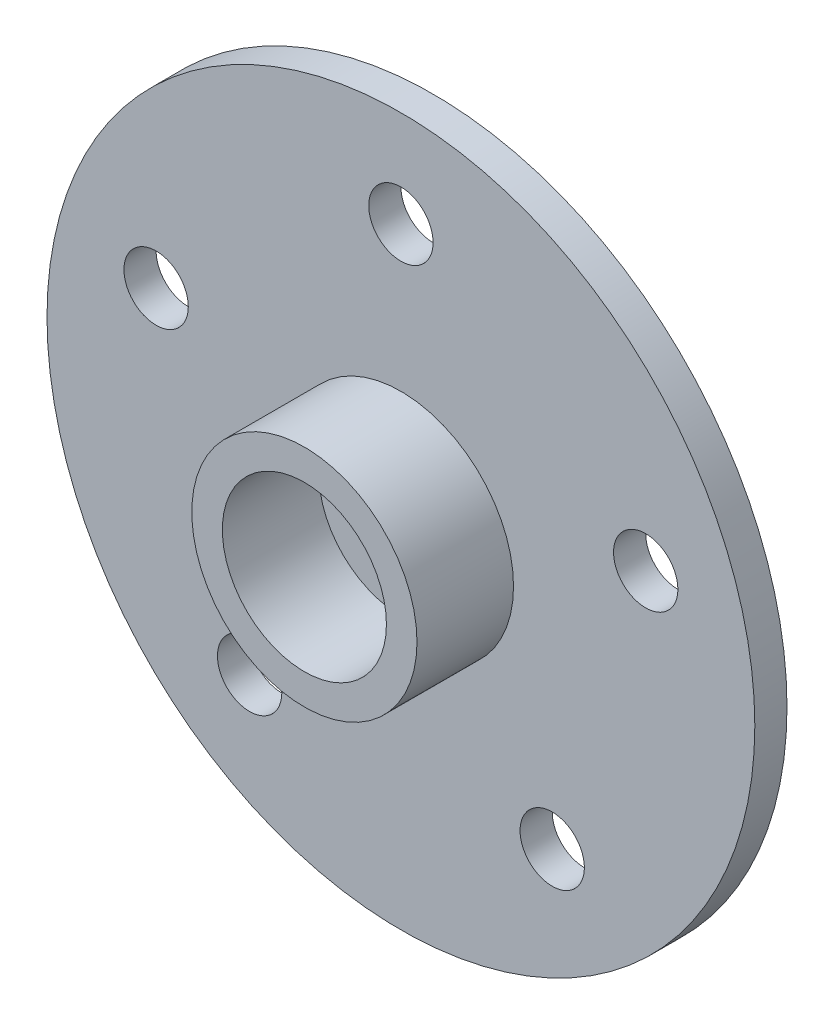
ISO-10303-21;
HEADER;
FILE_DESCRIPTION(('STEP AP214'),'2;1');
FILE_NAME('part.step','',(''),(''),'','','');
FILE_SCHEMA(('AUTOMOTIVE_DESIGN { 1 0 10303 214 1 1 1 1 }'));
ENDSEC;
DATA;
#1=APPLICATION_CONTEXT('core data for automotive mechanical design processes');
#2=APPLICATION_PROTOCOL_DEFINITION('international standard','automotive_design',2000,#1);
#3=PRODUCT_CONTEXT('',#1,'mechanical');
#4=PRODUCT('Part','Part','',(#3));
#5=PRODUCT_RELATED_PRODUCT_CATEGORY('part','',(#4));
#6=PRODUCT_DEFINITION_FORMATION('','',#4);
#7=PRODUCT_DEFINITION_CONTEXT('part definition',#1,'design');
#8=PRODUCT_DEFINITION('design','',#6,#7);
#9=PRODUCT_DEFINITION_SHAPE('','',#8);
#10=(LENGTH_UNIT() NAMED_UNIT(*) SI_UNIT(.MILLI.,.METRE.));
#11=(NAMED_UNIT(*) PLANE_ANGLE_UNIT() SI_UNIT($,.RADIAN.));
#12=(NAMED_UNIT(*) SI_UNIT($,.STERADIAN.) SOLID_ANGLE_UNIT());
#13=UNCERTAINTY_MEASURE_WITH_UNIT(LENGTH_MEASURE(1.E-05),#10,'distance_accuracy_value','');
#14=(GEOMETRIC_REPRESENTATION_CONTEXT(3) GLOBAL_UNCERTAINTY_ASSIGNED_CONTEXT((#13)) GLOBAL_UNIT_ASSIGNED_CONTEXT((#10,
#11,#12)) REPRESENTATION_CONTEXT('',''));
#15=CARTESIAN_POINT('',(0.,0.,0.));
#16=DIRECTION('',(0.,0.,1.));
#17=DIRECTION('',(1.,0.,0.));
#18=AXIS2_PLACEMENT_3D('',#15,#16,#17);
#19=CARTESIAN_POINT('',(0.,0.,2.));
#20=DIRECTION('',(0.,0.,1.));
#21=DIRECTION('',(1.,0.,0.));
#22=AXIS2_PLACEMENT_3D('',#19,#20,#21);
#23=PLANE('',#22);
#24=CARTESIAN_POINT('',(0.,0.,2.));
#25=DIRECTION('',(0.,0.,1.));
#26=DIRECTION('',(1.,0.,0.));
#27=AXIS2_PLACEMENT_3D('',#24,#25,#26);
#28=CIRCLE('',#27,3.15);
#29=CARTESIAN_POINT('',(3.15,0.,2.));
#30=VERTEX_POINT('',#29);
#31=EDGE_CURVE('E60',#30,#30,#28,.T.);
#32=ORIENTED_EDGE('',*,*,#31,.F.);
#33=EDGE_LOOP('',(#32));
#34=FACE_BOUND('',#33,.T.);
#35=CARTESIAN_POINT('',(0.,0.,2.));
#36=DIRECTION('',(0.,0.,1.));
#37=DIRECTION('',(1.,0.,0.));
#38=AXIS2_PLACEMENT_3D('',#35,#36,#37);
#39=CIRCLE('',#38,5.1);
#40=CARTESIAN_POINT('',(5.1,0.,2.));
#41=VERTEX_POINT('',#40);
#42=EDGE_CURVE('E10',#41,#41,#39,.F.);
#43=ORIENTED_EDGE('',*,*,#42,.F.);
#44=EDGE_LOOP('',(#43));
#45=FACE_BOUND('',#44,.T.);
#46=ADVANCED_FACE('F33',(#34,#45),#23,.T.);
#47=CARTESIAN_POINT('',(0.,0.,2.));
#48=DIRECTION('',(0.,0.,1.));
#49=DIRECTION('',(1.,0.,0.));
#50=AXIS2_PLACEMENT_3D('',#47,#48,#49);
#51=CIRCLE('',#50,7.);
#52=CARTESIAN_POINT('',(7.,0.,2.));
#53=VERTEX_POINT('',#52);
#54=EDGE_CURVE('E87',#53,#53,#51,.T.);
#55=ORIENTED_EDGE('',*,*,#54,.F.);
#56=EDGE_LOOP('',(#55));
#57=FACE_BOUND('',#56,.T.);
#58=CARTESIAN_POINT('',(-9.40456403667834,-12.9442719099996,2.));
#59=DIRECTION('',(0.,0.,1.));
#60=DIRECTION('',(1.,0.,0.));
#61=AXIS2_PLACEMENT_3D('',#58,#59,#60);
#62=CIRCLE('',#61,2.);
#63=CARTESIAN_POINT('',(-7.40456403667834,-12.9442719099996,2.));
#64=VERTEX_POINT('',#63);
#65=EDGE_CURVE('E72',#64,#64,#62,.T.);
#66=ORIENTED_EDGE('',*,*,#65,.F.);
#67=EDGE_LOOP('',(#66));
#68=FACE_BOUND('',#67,.T.);
#69=CARTESIAN_POINT('',(0.,16.,2.));
#70=DIRECTION('',(0.,0.,1.));
#71=DIRECTION('',(1.,0.,0.));
#72=AXIS2_PLACEMENT_3D('',#69,#70,#71);
#73=CIRCLE('',#72,2.);
#74=CARTESIAN_POINT('',(2.,16.,2.));
#75=VERTEX_POINT('',#74);
#76=EDGE_CURVE('E49',#75,#75,#73,.T.);
#77=ORIENTED_EDGE('',*,*,#76,.F.);
#78=EDGE_LOOP('',(#77));
#79=FACE_BOUND('',#78,.T.);
#80=CARTESIAN_POINT('',(0.,0.,2.));
#81=DIRECTION('',(0.,0.,1.));
#82=DIRECTION('',(1.,0.,0.));
#83=AXIS2_PLACEMENT_3D('',#80,#81,#82);
#84=CIRCLE('',#83,22.);
#85=CARTESIAN_POINT('',(22.,0.,2.));
#86=VERTEX_POINT('',#85);
#87=EDGE_CURVE('E40',#86,#86,#84,.T.);
#88=ORIENTED_EDGE('',*,*,#87,.T.);
#89=EDGE_LOOP('',(#88));
#90=FACE_BOUND('',#89,.T.);
#91=CARTESIAN_POINT('',(15.2169042607229,4.94427190999981,2.));
#92=DIRECTION('',(0.,0.,1.));
#93=DIRECTION('',(1.,0.,0.));
#94=AXIS2_PLACEMENT_3D('',#91,#92,#93);
#95=CIRCLE('',#94,2.);
#96=CARTESIAN_POINT('',(17.2169042607229,4.94427190999981,2.));
#97=VERTEX_POINT('',#96);
#98=EDGE_CURVE('E54',#97,#97,#95,.T.);
#99=ORIENTED_EDGE('',*,*,#98,.F.);
#100=EDGE_LOOP('',(#99));
#101=FACE_BOUND('',#100,.T.);
#102=CARTESIAN_POINT('',(9.4045640366808,-12.9442719099988,2.));
#103=DIRECTION('',(0.,0.,1.));
#104=DIRECTION('',(1.,0.,0.));
#105=AXIS2_PLACEMENT_3D('',#102,#103,#104);
#106=CIRCLE('',#105,2.);
#107=CARTESIAN_POINT('',(11.4045640366808,-12.9442719099988,2.));
#108=VERTEX_POINT('',#107);
#109=EDGE_CURVE('E66',#108,#108,#106,.T.);
#110=ORIENTED_EDGE('',*,*,#109,.F.);
#111=EDGE_LOOP('',(#110));
#112=FACE_BOUND('',#111,.T.);
#113=CARTESIAN_POINT('',(-15.216904260722,4.94427190999851,2.));
#114=DIRECTION('',(0.,0.,1.));
#115=DIRECTION('',(1.,0.,0.));
#116=AXIS2_PLACEMENT_3D('',#113,#114,#115);
#117=CIRCLE('',#116,2.);
#118=CARTESIAN_POINT('',(-13.216904260722,4.94427190999851,2.));
#119=VERTEX_POINT('',#118);
#120=EDGE_CURVE('E78',#119,#119,#117,.T.);
#121=ORIENTED_EDGE('',*,*,#120,.F.);
#122=EDGE_LOOP('',(#121));
#123=FACE_BOUND('',#122,.T.);
#124=ADVANCED_FACE('F115',(#57,#68,#79,#90,#101,#112,#123),#23,.T.);
#125=CARTESIAN_POINT('',(0.,0.,0.));
#126=DIRECTION('',(0.,0.,1.));
#127=DIRECTION('',(1.,0.,0.));
#128=AXIS2_PLACEMENT_3D('',#125,#126,#127);
#129=PLANE('',#128);
#130=CARTESIAN_POINT('',(0.,0.,0.));
#131=DIRECTION('',(0.,0.,1.));
#132=DIRECTION('',(1.,0.,0.));
#133=AXIS2_PLACEMENT_3D('',#130,#131,#132);
#134=CIRCLE('',#133,22.);
#135=CARTESIAN_POINT('',(22.,0.,0.));
#136=VERTEX_POINT('',#135);
#137=EDGE_CURVE('E44',#136,#136,#134,.T.);
#138=ORIENTED_EDGE('',*,*,#137,.F.);
#139=EDGE_LOOP('',(#138));
#140=FACE_BOUND('',#139,.T.);
#141=CARTESIAN_POINT('',(0.,16.,0.));
#142=DIRECTION('',(0.,0.,1.));
#143=DIRECTION('',(1.,0.,0.));
#144=AXIS2_PLACEMENT_3D('',#141,#142,#143);
#145=CIRCLE('',#144,2.);
#146=CARTESIAN_POINT('',(2.,16.,0.));
#147=VERTEX_POINT('',#146);
#148=EDGE_CURVE('E51',#147,#147,#145,.T.);
#149=ORIENTED_EDGE('',*,*,#148,.T.);
#150=EDGE_LOOP('',(#149));
#151=FACE_BOUND('',#150,.T.);
#152=CARTESIAN_POINT('',(15.2169042607229,4.94427190999981,0.));
#153=DIRECTION('',(0.,0.,1.));
#154=DIRECTION('',(1.,0.,0.));
#155=AXIS2_PLACEMENT_3D('',#152,#153,#154);
#156=CIRCLE('',#155,2.);
#157=CARTESIAN_POINT('',(17.2169042607229,4.94427190999981,0.));
#158=VERTEX_POINT('',#157);
#159=EDGE_CURVE('E57',#158,#158,#156,.T.);
#160=ORIENTED_EDGE('',*,*,#159,.T.);
#161=EDGE_LOOP('',(#160));
#162=FACE_BOUND('',#161,.T.);
#163=CARTESIAN_POINT('',(0.,0.,0.));
#164=DIRECTION('',(0.,0.,1.));
#165=DIRECTION('',(1.,0.,0.));
#166=AXIS2_PLACEMENT_3D('',#163,#164,#165);
#167=CIRCLE('',#166,3.15);
#168=CARTESIAN_POINT('',(3.15,0.,0.));
#169=VERTEX_POINT('',#168);
#170=EDGE_CURVE('E63',#169,#169,#167,.T.);
#171=ORIENTED_EDGE('',*,*,#170,.T.);
#172=EDGE_LOOP('',(#171));
#173=FACE_BOUND('',#172,.T.);
#174=CARTESIAN_POINT('',(9.4045640366808,-12.9442719099988,0.));
#175=DIRECTION('',(0.,0.,1.));
#176=DIRECTION('',(1.,0.,0.));
#177=AXIS2_PLACEMENT_3D('',#174,#175,#176);
#178=CIRCLE('',#177,2.);
#179=CARTESIAN_POINT('',(11.4045640366808,-12.9442719099988,0.));
#180=VERTEX_POINT('',#179);
#181=EDGE_CURVE('E69',#180,#180,#178,.T.);
#182=ORIENTED_EDGE('',*,*,#181,.T.);
#183=EDGE_LOOP('',(#182));
#184=FACE_BOUND('',#183,.T.);
#185=CARTESIAN_POINT('',(-9.40456403667834,-12.9442719099996,0.));
#186=DIRECTION('',(0.,0.,1.));
#187=DIRECTION('',(1.,0.,0.));
#188=AXIS2_PLACEMENT_3D('',#185,#186,#187);
#189=CIRCLE('',#188,2.);
#190=CARTESIAN_POINT('',(-7.40456403667834,-12.9442719099996,0.));
#191=VERTEX_POINT('',#190);
#192=EDGE_CURVE('E75',#191,#191,#189,.T.);
#193=ORIENTED_EDGE('',*,*,#192,.T.);
#194=EDGE_LOOP('',(#193));
#195=FACE_BOUND('',#194,.T.);
#196=CARTESIAN_POINT('',(-15.216904260722,4.94427190999851,0.));
#197=DIRECTION('',(0.,0.,1.));
#198=DIRECTION('',(1.,0.,0.));
#199=AXIS2_PLACEMENT_3D('',#196,#197,#198);
#200=CIRCLE('',#199,2.);
#201=CARTESIAN_POINT('',(-13.216904260722,4.94427190999851,0.));
#202=VERTEX_POINT('',#201);
#203=EDGE_CURVE('E81',#202,#202,#200,.T.);
#204=ORIENTED_EDGE('',*,*,#203,.T.);
#205=EDGE_LOOP('',(#204));
#206=FACE_BOUND('',#205,.T.);
#207=ADVANCED_FACE('F121',(#140,#151,#162,#173,#184,#195,#206),#129,.F.);
#208=CARTESIAN_POINT('',(0.,0.,2.));
#209=DIRECTION('',(0.,0.,-1.));
#210=DIRECTION('',(-1.,0.,0.));
#211=AXIS2_PLACEMENT_3D('',#208,#209,#210);
#212=CYLINDRICAL_SURFACE('',#211,22.);
#213=ORIENTED_EDGE('',*,*,#87,.F.);
#214=EDGE_LOOP('',(#213));
#215=FACE_BOUND('',#214,.T.);
#216=ORIENTED_EDGE('',*,*,#137,.T.);
#217=EDGE_LOOP('',(#216));
#218=FACE_BOUND('',#217,.T.);
#219=ADVANCED_FACE('F35',(#215,#218),#212,.T.);
#220=CARTESIAN_POINT('',(0.,16.,2.));
#221=DIRECTION('',(0.,0.,-1.));
#222=DIRECTION('',(-1.,0.,0.));
#223=AXIS2_PLACEMENT_3D('',#220,#221,#222);
#224=CYLINDRICAL_SURFACE('',#223,2.);
#225=ORIENTED_EDGE('',*,*,#76,.T.);
#226=EDGE_LOOP('',(#225));
#227=FACE_BOUND('',#226,.T.);
#228=ORIENTED_EDGE('',*,*,#148,.F.);
#229=EDGE_LOOP('',(#228));
#230=FACE_BOUND('',#229,.T.);
#231=ADVANCED_FACE('F126',(#227,#230),#224,.F.);
#232=CARTESIAN_POINT('',(15.2169042607229,4.94427190999981,2.));
#233=DIRECTION('',(0.,0.,-1.));
#234=DIRECTION('',(-1.,0.,0.));
#235=AXIS2_PLACEMENT_3D('',#232,#233,#234);
#236=CYLINDRICAL_SURFACE('',#235,2.);
#237=ORIENTED_EDGE('',*,*,#98,.T.);
#238=EDGE_LOOP('',(#237));
#239=FACE_BOUND('',#238,.T.);
#240=ORIENTED_EDGE('',*,*,#159,.F.);
#241=EDGE_LOOP('',(#240));
#242=FACE_BOUND('',#241,.T.);
#243=ADVANCED_FACE('F161',(#239,#242),#236,.F.);
#244=CARTESIAN_POINT('',(0.,0.,2.));
#245=DIRECTION('',(0.,0.,-1.));
#246=DIRECTION('',(-1.,0.,0.));
#247=AXIS2_PLACEMENT_3D('',#244,#245,#246);
#248=CYLINDRICAL_SURFACE('',#247,3.15);
#249=ORIENTED_EDGE('',*,*,#31,.T.);
#250=EDGE_LOOP('',(#249));
#251=FACE_BOUND('',#250,.T.);
#252=ORIENTED_EDGE('',*,*,#170,.F.);
#253=EDGE_LOOP('',(#252));
#254=FACE_BOUND('',#253,.T.);
#255=ADVANCED_FACE('F156',(#251,#254),#248,.F.);
#256=CARTESIAN_POINT('',(9.4045640366808,-12.9442719099988,2.));
#257=DIRECTION('',(0.,0.,-1.));
#258=DIRECTION('',(-1.,0.,0.));
#259=AXIS2_PLACEMENT_3D('',#256,#257,#258);
#260=CYLINDRICAL_SURFACE('',#259,2.);
#261=ORIENTED_EDGE('',*,*,#109,.T.);
#262=EDGE_LOOP('',(#261));
#263=FACE_BOUND('',#262,.T.);
#264=ORIENTED_EDGE('',*,*,#181,.F.);
#265=EDGE_LOOP('',(#264));
#266=FACE_BOUND('',#265,.T.);
#267=ADVANCED_FACE('F150',(#263,#266),#260,.F.);
#268=CARTESIAN_POINT('',(-9.40456403667834,-12.9442719099996,2.));
#269=DIRECTION('',(0.,0.,-1.));
#270=DIRECTION('',(-1.,0.,0.));
#271=AXIS2_PLACEMENT_3D('',#268,#269,#270);
#272=CYLINDRICAL_SURFACE('',#271,2.);
#273=ORIENTED_EDGE('',*,*,#65,.T.);
#274=EDGE_LOOP('',(#273));
#275=FACE_BOUND('',#274,.T.);
#276=ORIENTED_EDGE('',*,*,#192,.F.);
#277=EDGE_LOOP('',(#276));
#278=FACE_BOUND('',#277,.T.);
#279=ADVANCED_FACE('F110',(#275,#278),#272,.F.);
#280=CARTESIAN_POINT('',(-15.216904260722,4.94427190999851,2.));
#281=DIRECTION('',(0.,0.,-1.));
#282=DIRECTION('',(-1.,0.,0.));
#283=AXIS2_PLACEMENT_3D('',#280,#281,#282);
#284=CYLINDRICAL_SURFACE('',#283,2.);
#285=ORIENTED_EDGE('',*,*,#120,.T.);
#286=EDGE_LOOP('',(#285));
#287=FACE_BOUND('',#286,.T.);
#288=ORIENTED_EDGE('',*,*,#203,.F.);
#289=EDGE_LOOP('',(#288));
#290=FACE_BOUND('',#289,.T.);
#291=ADVANCED_FACE('F101',(#287,#290),#284,.F.);
#292=CARTESIAN_POINT('',(0.,0.,8.));
#293=DIRECTION('',(0.,0.,1.));
#294=DIRECTION('',(1.,0.,0.));
#295=AXIS2_PLACEMENT_3D('',#292,#293,#294);
#296=PLANE('',#295);
#297=CARTESIAN_POINT('',(0.,0.,8.));
#298=DIRECTION('',(0.,0.,1.));
#299=DIRECTION('',(1.,0.,0.));
#300=AXIS2_PLACEMENT_3D('',#297,#298,#299);
#301=CIRCLE('',#300,7.);
#302=CARTESIAN_POINT('',(7.,0.,8.));
#303=VERTEX_POINT('',#302);
#304=EDGE_CURVE('E84',#303,#303,#301,.T.);
#305=ORIENTED_EDGE('',*,*,#304,.T.);
#306=EDGE_LOOP('',(#305));
#307=FACE_BOUND('',#306,.T.);
#308=CARTESIAN_POINT('',(0.,0.,8.));
#309=DIRECTION('',(0.,0.,1.));
#310=DIRECTION('',(1.,0.,0.));
#311=AXIS2_PLACEMENT_3D('',#308,#309,#310);
#312=CIRCLE('',#311,5.1);
#313=CARTESIAN_POINT('',(5.1,0.,8.));
#314=VERTEX_POINT('',#313);
#315=EDGE_CURVE('E90',#314,#314,#312,.T.);
#316=ORIENTED_EDGE('',*,*,#315,.F.);
#317=EDGE_LOOP('',(#316));
#318=FACE_BOUND('',#317,.T.);
#319=ADVANCED_FACE('F98',(#307,#318),#296,.T.);
#320=CARTESIAN_POINT('',(0.,0.,8.));
#321=DIRECTION('',(0.,0.,-1.));
#322=DIRECTION('',(-1.,0.,0.));
#323=AXIS2_PLACEMENT_3D('',#320,#321,#322);
#324=CYLINDRICAL_SURFACE('',#323,7.);
#325=ORIENTED_EDGE('',*,*,#304,.F.);
#326=EDGE_LOOP('',(#325));
#327=FACE_BOUND('',#326,.T.);
#328=ORIENTED_EDGE('',*,*,#54,.T.);
#329=EDGE_LOOP('',(#328));
#330=FACE_BOUND('',#329,.T.);
#331=ADVANCED_FACE('F100',(#327,#330),#324,.T.);
#332=CARTESIAN_POINT('',(0.,0.,8.));
#333=DIRECTION('',(0.,0.,-1.));
#334=DIRECTION('',(-1.,0.,0.));
#335=AXIS2_PLACEMENT_3D('',#332,#333,#334);
#336=CYLINDRICAL_SURFACE('',#335,5.1);
#337=ORIENTED_EDGE('',*,*,#315,.T.);
#338=EDGE_LOOP('',(#337));
#339=FACE_BOUND('',#338,.T.);
#340=ORIENTED_EDGE('',*,*,#42,.T.);
#341=EDGE_LOOP('',(#340));
#342=FACE_BOUND('',#341,.T.);
#343=ADVANCED_FACE('F96',(#339,#342),#336,.F.);
#344=CLOSED_SHELL('',(#46,#124,#207,#219,#231,#243,#255,#267,#279,#291,#319,#331,#343));
#345=MANIFOLD_SOLID_BREP('B2',#344);
#346=ADVANCED_BREP_SHAPE_REPRESENTATION('',(#18,#345),#14);
#347=SHAPE_DEFINITION_REPRESENTATION(#9,#346);
ENDSEC;
END-ISO-10303-21;
